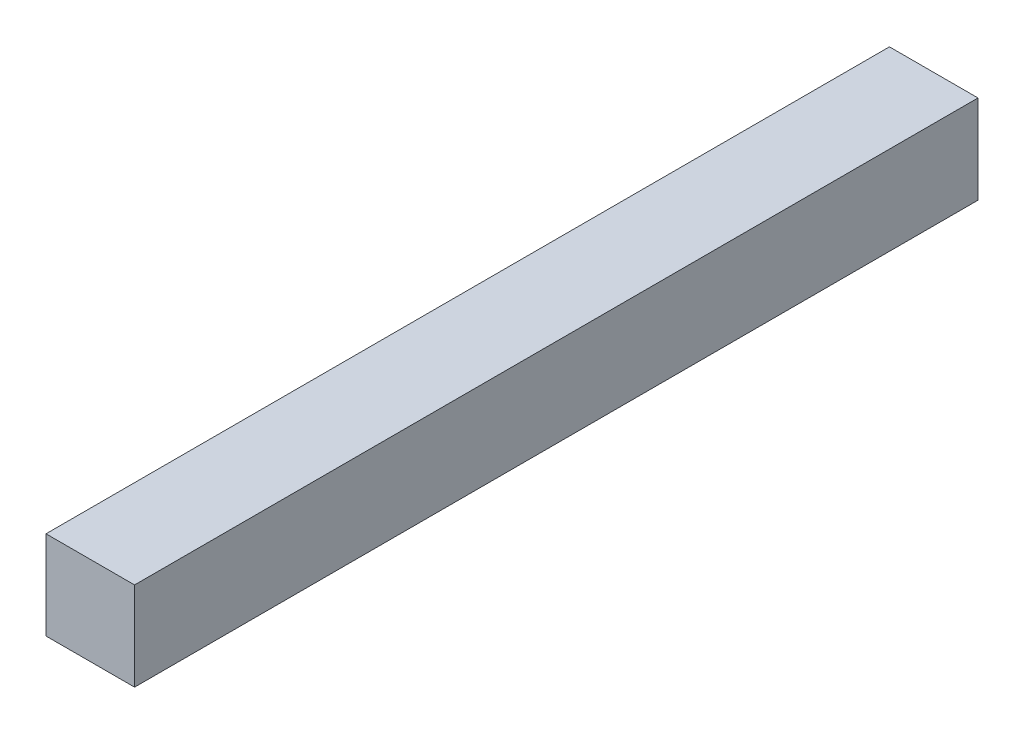
ISO-10303-21;
HEADER;
FILE_DESCRIPTION(('STEP AP214'),'2;1');
FILE_NAME('part.step','',(''),(''),'','','');
FILE_SCHEMA(('AUTOMOTIVE_DESIGN { 1 0 10303 214 1 1 1 1 }'));
ENDSEC;
DATA;
#1=APPLICATION_CONTEXT('core data for automotive mechanical design processes');
#2=APPLICATION_PROTOCOL_DEFINITION('international standard','automotive_design',2000,#1);
#3=PRODUCT_CONTEXT('',#1,'mechanical');
#4=PRODUCT('Part','Part','',(#3));
#5=PRODUCT_RELATED_PRODUCT_CATEGORY('part','',(#4));
#6=PRODUCT_DEFINITION_FORMATION('','',#4);
#7=PRODUCT_DEFINITION_CONTEXT('part definition',#1,'design');
#8=PRODUCT_DEFINITION('design','',#6,#7);
#9=PRODUCT_DEFINITION_SHAPE('','',#8);
#10=(LENGTH_UNIT() NAMED_UNIT(*) SI_UNIT(.MILLI.,.METRE.));
#11=(NAMED_UNIT(*) PLANE_ANGLE_UNIT() SI_UNIT($,.RADIAN.));
#12=(NAMED_UNIT(*) SI_UNIT($,.STERADIAN.) SOLID_ANGLE_UNIT());
#13=UNCERTAINTY_MEASURE_WITH_UNIT(LENGTH_MEASURE(1.E-05),#10,'distance_accuracy_value','');
#14=(GEOMETRIC_REPRESENTATION_CONTEXT(3) GLOBAL_UNCERTAINTY_ASSIGNED_CONTEXT((#13)) GLOBAL_UNIT_ASSIGNED_CONTEXT((#10,
#11,#12)) REPRESENTATION_CONTEXT('',''));
#15=CARTESIAN_POINT('',(0.,0.,0.));
#16=DIRECTION('',(0.,0.,1.));
#17=DIRECTION('',(1.,0.,0.));
#18=AXIS2_PLACEMENT_3D('',#15,#16,#17);
#19=CARTESIAN_POINT('',(10.5,10.5,200.));
#20=DIRECTION('',(-1.,0.,0.));
#21=DIRECTION('',(0.,-1.,0.));
#22=AXIS2_PLACEMENT_3D('',#19,#20,#21);
#23=PLANE('',#22);
#24=DIRECTION('',(0.,1.,0.));
#25=VECTOR('',#24,1.);
#26=CARTESIAN_POINT('',(10.5,10.5,0.));
#27=LINE('',#26,#25);
#28=CARTESIAN_POINT('',(10.5,-10.5,0.));
#29=VERTEX_POINT('',#28);
#30=CARTESIAN_POINT('',(10.5,10.5,0.));
#31=VERTEX_POINT('',#30);
#32=EDGE_CURVE('E94',#29,#31,#27,.T.);
#33=ORIENTED_EDGE('',*,*,#32,.T.);
#34=DIRECTION('',(0.,0.,-1.));
#35=VECTOR('',#34,1.);
#36=CARTESIAN_POINT('',(10.5,10.5,200.));
#37=LINE('',#36,#35);
#38=CARTESIAN_POINT('',(10.5,10.5,200.));
#39=VERTEX_POINT('',#38);
#40=EDGE_CURVE('E11',#39,#31,#37,.T.);
#41=ORIENTED_EDGE('',*,*,#40,.F.);
#42=DIRECTION('',(0.,1.,0.));
#43=VECTOR('',#42,1.);
#44=CARTESIAN_POINT('',(10.5,10.5,200.));
#45=LINE('',#44,#43);
#46=CARTESIAN_POINT('',(10.5,-10.5,200.));
#47=VERTEX_POINT('',#46);
#48=EDGE_CURVE('E82',#47,#39,#45,.T.);
#49=ORIENTED_EDGE('',*,*,#48,.F.);
#50=DIRECTION('',(0.,0.,-1.));
#51=VECTOR('',#50,1.);
#52=CARTESIAN_POINT('',(10.5,-10.5,200.));
#53=LINE('',#52,#51);
#54=EDGE_CURVE('E90',#47,#29,#53,.T.);
#55=ORIENTED_EDGE('',*,*,#54,.T.);
#56=EDGE_LOOP('',(#33,#41,#49,#55));
#57=FACE_BOUND('',#56,.T.);
#58=ADVANCED_FACE('F31',(#57),#23,.F.);
#59=CARTESIAN_POINT('',(-10.5,10.5,200.));
#60=DIRECTION('',(0.,-1.,0.));
#61=DIRECTION('',(0.,0.,-1.));
#62=AXIS2_PLACEMENT_3D('',#59,#60,#61);
#63=PLANE('',#62);
#64=DIRECTION('',(-1.,0.,0.));
#65=VECTOR('',#64,1.);
#66=CARTESIAN_POINT('',(-10.5,10.5,0.));
#67=LINE('',#66,#65);
#68=CARTESIAN_POINT('',(-10.5,10.5,0.));
#69=VERTEX_POINT('',#68);
#70=EDGE_CURVE('E86',#31,#69,#67,.T.);
#71=ORIENTED_EDGE('',*,*,#70,.T.);
#72=DIRECTION('',(0.,0.,-1.));
#73=VECTOR('',#72,1.);
#74=CARTESIAN_POINT('',(-10.5,10.5,200.));
#75=LINE('',#74,#73);
#76=CARTESIAN_POINT('',(-10.5,10.5,200.));
#77=VERTEX_POINT('',#76);
#78=EDGE_CURVE('E39',#77,#69,#75,.T.);
#79=ORIENTED_EDGE('',*,*,#78,.F.);
#80=DIRECTION('',(-1.,0.,0.));
#81=VECTOR('',#80,1.);
#82=CARTESIAN_POINT('',(-10.5,10.5,200.));
#83=LINE('',#82,#81);
#84=EDGE_CURVE('E77',#39,#77,#83,.T.);
#85=ORIENTED_EDGE('',*,*,#84,.F.);
#86=ORIENTED_EDGE('',*,*,#40,.T.);
#87=EDGE_LOOP('',(#71,#79,#85,#86));
#88=FACE_BOUND('',#87,.T.);
#89=ADVANCED_FACE('F85',(#88),#63,.F.);
#90=CARTESIAN_POINT('',(-10.5,10.5,200.));
#91=DIRECTION('',(1.,0.,0.));
#92=DIRECTION('',(0.,1.,0.));
#93=AXIS2_PLACEMENT_3D('',#90,#91,#92);
#94=PLANE('',#93);
#95=DIRECTION('',(0.,-1.,0.));
#96=VECTOR('',#95,1.);
#97=CARTESIAN_POINT('',(-10.5,10.5,0.));
#98=LINE('',#97,#96);
#99=CARTESIAN_POINT('',(-10.5,-10.5,0.));
#100=VERTEX_POINT('',#99);
#101=EDGE_CURVE('E64',#69,#100,#98,.T.);
#102=ORIENTED_EDGE('',*,*,#101,.T.);
#103=DIRECTION('',(0.,0.,-1.));
#104=VECTOR('',#103,1.);
#105=CARTESIAN_POINT('',(-10.5,-10.5,200.));
#106=LINE('',#105,#104);
#107=CARTESIAN_POINT('',(-10.5,-10.5,200.));
#108=VERTEX_POINT('',#107);
#109=EDGE_CURVE('E87',#108,#100,#106,.T.);
#110=ORIENTED_EDGE('',*,*,#109,.F.);
#111=DIRECTION('',(0.,-1.,0.));
#112=VECTOR('',#111,1.);
#113=CARTESIAN_POINT('',(-10.5,10.5,200.));
#114=LINE('',#113,#112);
#115=EDGE_CURVE('E80',#77,#108,#114,.T.);
#116=ORIENTED_EDGE('',*,*,#115,.F.);
#117=ORIENTED_EDGE('',*,*,#78,.T.);
#118=EDGE_LOOP('',(#102,#110,#116,#117));
#119=FACE_BOUND('',#118,.T.);
#120=ADVANCED_FACE('F88',(#119),#94,.F.);
#121=CARTESIAN_POINT('',(-10.5,-10.5,200.));
#122=DIRECTION('',(0.,1.,0.));
#123=DIRECTION('',(0.,0.,1.));
#124=AXIS2_PLACEMENT_3D('',#121,#122,#123);
#125=PLANE('',#124);
#126=DIRECTION('',(1.,0.,0.));
#127=VECTOR('',#126,1.);
#128=CARTESIAN_POINT('',(-10.5,-10.5,0.));
#129=LINE('',#128,#127);
#130=EDGE_CURVE('E70',#100,#29,#129,.T.);
#131=ORIENTED_EDGE('',*,*,#130,.T.);
#132=ORIENTED_EDGE('',*,*,#54,.F.);
#133=DIRECTION('',(1.,0.,0.));
#134=VECTOR('',#133,1.);
#135=CARTESIAN_POINT('',(-10.5,-10.5,200.));
#136=LINE('',#135,#134);
#137=EDGE_CURVE('E47',#108,#47,#136,.T.);
#138=ORIENTED_EDGE('',*,*,#137,.F.);
#139=ORIENTED_EDGE('',*,*,#109,.T.);
#140=EDGE_LOOP('',(#131,#132,#138,#139));
#141=FACE_BOUND('',#140,.T.);
#142=ADVANCED_FACE('F101',(#141),#125,.F.);
#143=CARTESIAN_POINT('',(10.5,-10.5,200.));
#144=DIRECTION('',(0.,0.,1.));
#145=DIRECTION('',(1.,0.,0.));
#146=AXIS2_PLACEMENT_3D('',#143,#144,#145);
#147=PLANE('',#146);
#148=ORIENTED_EDGE('',*,*,#48,.T.);
#149=ORIENTED_EDGE('',*,*,#84,.T.);
#150=ORIENTED_EDGE('',*,*,#115,.T.);
#151=ORIENTED_EDGE('',*,*,#137,.T.);
#152=EDGE_LOOP('',(#148,#149,#150,#151));
#153=FACE_BOUND('',#152,.T.);
#154=ADVANCED_FACE('F78',(#153),#147,.T.);
#155=CARTESIAN_POINT('',(10.5,-10.5,0.));
#156=DIRECTION('',(0.,0.,1.));
#157=DIRECTION('',(1.,0.,0.));
#158=AXIS2_PLACEMENT_3D('',#155,#156,#157);
#159=PLANE('',#158);
#160=ORIENTED_EDGE('',*,*,#32,.F.);
#161=ORIENTED_EDGE('',*,*,#130,.F.);
#162=ORIENTED_EDGE('',*,*,#101,.F.);
#163=ORIENTED_EDGE('',*,*,#70,.F.);
#164=EDGE_LOOP('',(#160,#161,#162,#163));
#165=FACE_BOUND('',#164,.T.);
#166=ADVANCED_FACE('F104',(#165),#159,.F.);
#167=CLOSED_SHELL('',(#58,#89,#120,#142,#154,#166));
#168=MANIFOLD_SOLID_BREP('B2',#167);
#169=ADVANCED_BREP_SHAPE_REPRESENTATION('',(#18,#168),#14);
#170=SHAPE_DEFINITION_REPRESENTATION(#9,#169);
ENDSEC;
END-ISO-10303-21;
